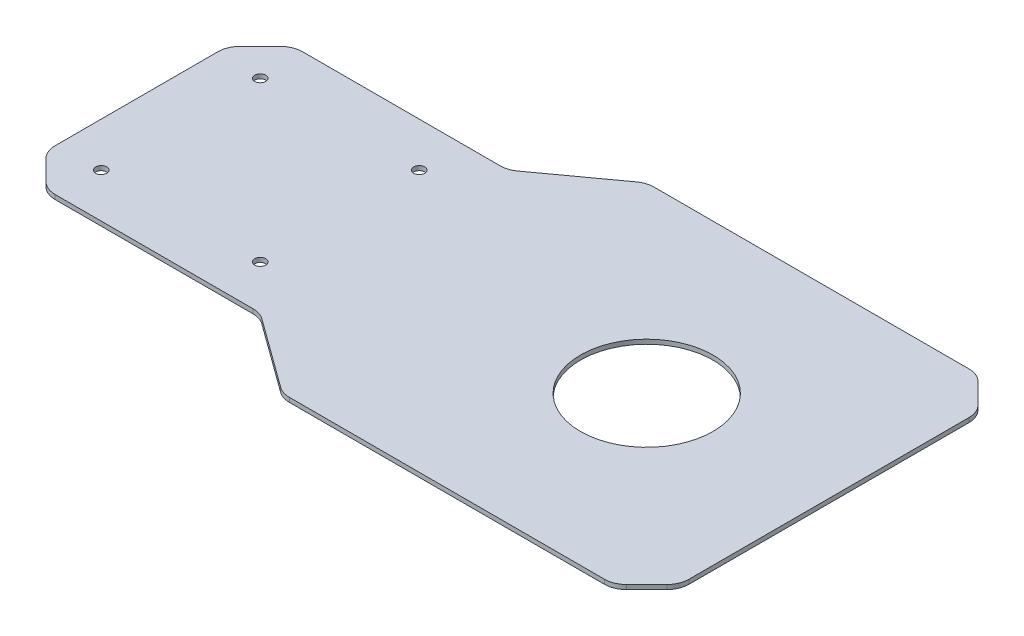
ISO-10303-21;
HEADER;
FILE_DESCRIPTION(('STEP AP214'),'2;1');
FILE_NAME('part.step','',(''),(''),'','','');
FILE_SCHEMA(('AUTOMOTIVE_DESIGN { 1 0 10303 214 1 1 1 1 }'));
ENDSEC;
DATA;
#1=APPLICATION_CONTEXT('core data for automotive mechanical design processes');
#2=APPLICATION_PROTOCOL_DEFINITION('international standard','automotive_design',2000,#1);
#3=PRODUCT_CONTEXT('',#1,'mechanical');
#4=PRODUCT('Part','Part','',(#3));
#5=PRODUCT_RELATED_PRODUCT_CATEGORY('part','',(#4));
#6=PRODUCT_DEFINITION_FORMATION('','',#4);
#7=PRODUCT_DEFINITION_CONTEXT('part definition',#1,'design');
#8=PRODUCT_DEFINITION('design','',#6,#7);
#9=PRODUCT_DEFINITION_SHAPE('','',#8);
#10=(LENGTH_UNIT() NAMED_UNIT(*) SI_UNIT(.MILLI.,.METRE.));
#11=(NAMED_UNIT(*) PLANE_ANGLE_UNIT() SI_UNIT($,.RADIAN.));
#12=(NAMED_UNIT(*) SI_UNIT($,.STERADIAN.) SOLID_ANGLE_UNIT());
#13=UNCERTAINTY_MEASURE_WITH_UNIT(LENGTH_MEASURE(1.E-05),#10,'distance_accuracy_value','');
#14=(GEOMETRIC_REPRESENTATION_CONTEXT(3) GLOBAL_UNCERTAINTY_ASSIGNED_CONTEXT((#13)) GLOBAL_UNIT_ASSIGNED_CONTEXT((#10,
#11,#12)) REPRESENTATION_CONTEXT('',''));
#15=CARTESIAN_POINT('',(0.,0.,0.));
#16=DIRECTION('',(0.,0.,1.));
#17=DIRECTION('',(1.,0.,0.));
#18=AXIS2_PLACEMENT_3D('',#15,#16,#17);
#19=CARTESIAN_POINT('',(257.5,2.,-82.5));
#20=DIRECTION('',(-1.,0.,0.));
#21=DIRECTION('',(0.,0.,1.));
#22=AXIS2_PLACEMENT_3D('',#19,#20,#21);
#23=PLANE('',#22);
#24=DIRECTION('',(0.,0.,-1.));
#25=VECTOR('',#24,1.);
#26=CARTESIAN_POINT('',(257.5,0.,-82.5));
#27=LINE('',#26,#25);
#28=CARTESIAN_POINT('',(257.5,0.,63.357864376269));
#29=VERTEX_POINT('',#28);
#30=CARTESIAN_POINT('',(257.5,0.,-63.357864376269));
#31=VERTEX_POINT('',#30);
#32=EDGE_CURVE('E421',#29,#31,#27,.T.);
#33=ORIENTED_EDGE('',*,*,#32,.T.);
#34=DIRECTION('',(0.,-1.,0.));
#35=VECTOR('',#34,1.);
#36=CARTESIAN_POINT('',(257.5,2.,-63.357864376269));
#37=LINE('',#36,#35);
#38=CARTESIAN_POINT('',(257.5,2.,-63.357864376269));
#39=VERTEX_POINT('',#38);
#40=EDGE_CURVE('E338',#31,#39,#37,.F.);
#41=ORIENTED_EDGE('',*,*,#40,.T.);
#42=DIRECTION('',(0.,0.,-1.));
#43=VECTOR('',#42,1.);
#44=CARTESIAN_POINT('',(257.5,2.,-82.5));
#45=LINE('',#44,#43);
#46=CARTESIAN_POINT('',(257.5,2.,63.357864376269));
#47=VERTEX_POINT('',#46);
#48=EDGE_CURVE('E445',#47,#39,#45,.T.);
#49=ORIENTED_EDGE('',*,*,#48,.F.);
#50=DIRECTION('',(0.,1.,0.));
#51=VECTOR('',#50,1.);
#52=CARTESIAN_POINT('',(257.5,0.,63.357864376269));
#53=LINE('',#52,#51);
#54=EDGE_CURVE('E334',#47,#29,#53,.F.);
#55=ORIENTED_EDGE('',*,*,#54,.T.);
#56=EDGE_LOOP('',(#33,#41,#49,#55));
#57=FACE_BOUND('',#56,.T.);
#58=ADVANCED_FACE('F41',(#57),#23,.F.);
#59=CARTESIAN_POINT('',(92.5,2.,-82.5));
#60=DIRECTION('',(0.,0.,1.));
#61=DIRECTION('',(1.,0.,0.));
#62=AXIS2_PLACEMENT_3D('',#59,#60,#61);
#63=PLANE('',#62);
#64=DIRECTION('',(-1.,0.,0.));
#65=VECTOR('',#64,1.);
#66=CARTESIAN_POINT('',(92.5,2.,-82.5));
#67=LINE('',#66,#65);
#68=CARTESIAN_POINT('',(238.357864376269,2.,-82.5));
#69=VERTEX_POINT('',#68);
#70=CARTESIAN_POINT('',(95.7473328473115,2.,-82.5));
#71=VERTEX_POINT('',#70);
#72=EDGE_CURVE('E405',#69,#71,#67,.T.);
#73=ORIENTED_EDGE('',*,*,#72,.F.);
#74=DIRECTION('',(0.,1.,0.));
#75=VECTOR('',#74,1.);
#76=CARTESIAN_POINT('',(238.357864376269,0.,-82.5));
#77=LINE('',#76,#75);
#78=CARTESIAN_POINT('',(238.357864376269,0.,-82.5));
#79=VERTEX_POINT('',#78);
#80=EDGE_CURVE('E324',#69,#79,#77,.F.);
#81=ORIENTED_EDGE('',*,*,#80,.T.);
#82=DIRECTION('',(-1.,0.,0.));
#83=VECTOR('',#82,1.);
#84=CARTESIAN_POINT('',(92.5,0.,-82.5));
#85=LINE('',#84,#83);
#86=CARTESIAN_POINT('',(95.7473328473115,0.,-82.5));
#87=VERTEX_POINT('',#86);
#88=EDGE_CURVE('E392',#79,#87,#85,.T.);
#89=ORIENTED_EDGE('',*,*,#88,.T.);
#90=DIRECTION('',(0.,-1.,0.));
#91=VECTOR('',#90,1.);
#92=CARTESIAN_POINT('',(95.7473328473115,2.,-82.5));
#93=LINE('',#92,#91);
#94=EDGE_CURVE('E321',#87,#71,#93,.F.);
#95=ORIENTED_EDGE('',*,*,#94,.T.);
#96=EDGE_LOOP('',(#73,#81,#89,#95));
#97=FACE_BOUND('',#96,.T.);
#98=ADVANCED_FACE('F502',(#97),#63,.F.);
#99=CARTESIAN_POINT('',(56.,2.,-56.));
#100=DIRECTION('',(0.587512385943699,0.,0.809215173092264));
#101=DIRECTION('',(0.809215173092264,0.,-0.587512385943699));
#102=AXIS2_PLACEMENT_3D('',#99,#100,#101);
#103=PLANE('',#102);
#104=DIRECTION('',(-0.809215173092264,0.,0.587512385943699));
#105=VECTOR('',#104,1.);
#106=CARTESIAN_POINT('',(56.,0.,-56.));
#107=LINE('',#106,#105);
#108=CARTESIAN_POINT('',(89.8722089878745,0.,-80.5921517309227));
#109=VERTEX_POINT('',#108);
#110=CARTESIAN_POINT('',(58.6277910121254,0.,-57.9078482690774));
#111=VERTEX_POINT('',#110);
#112=EDGE_CURVE('E380',#109,#111,#107,.T.);
#113=ORIENTED_EDGE('',*,*,#112,.T.);
#114=DIRECTION('',(0.,-1.,0.));
#115=VECTOR('',#114,1.);
#116=CARTESIAN_POINT('',(58.6277910121254,2.,-57.9078482690774));
#117=LINE('',#116,#115);
#118=CARTESIAN_POINT('',(58.6277910121254,2.,-57.9078482690774));
#119=VERTEX_POINT('',#118);
#120=EDGE_CURVE('E367',#111,#119,#117,.F.);
#121=ORIENTED_EDGE('',*,*,#120,.T.);
#122=DIRECTION('',(-0.809215173092264,0.,0.587512385943699));
#123=VECTOR('',#122,1.);
#124=CARTESIAN_POINT('',(56.,2.,-56.));
#125=LINE('',#124,#123);
#126=CARTESIAN_POINT('',(89.8722089878745,2.,-80.5921517309227));
#127=VERTEX_POINT('',#126);
#128=EDGE_CURVE('E398',#127,#119,#125,.T.);
#129=ORIENTED_EDGE('',*,*,#128,.F.);
#130=DIRECTION('',(0.,-1.,0.));
#131=VECTOR('',#130,1.);
#132=CARTESIAN_POINT('',(89.8722089878745,2.,-80.5921517309227));
#133=LINE('',#132,#131);
#134=EDGE_CURVE('E363',#127,#109,#133,.T.);
#135=ORIENTED_EDGE('',*,*,#134,.T.);
#136=EDGE_LOOP('',(#113,#121,#129,#135));
#137=FACE_BOUND('',#136,.T.);
#138=ADVANCED_FACE('F387',(#137),#103,.F.);
#139=CARTESIAN_POINT('',(-56.,2.,-56.));
#140=DIRECTION('',(0.,0.,1.));
#141=DIRECTION('',(1.,0.,0.));
#142=AXIS2_PLACEMENT_3D('',#139,#140,#141);
#143=PLANE('',#142);
#144=DIRECTION('',(-1.,0.,0.));
#145=VECTOR('',#144,1.);
#146=CARTESIAN_POINT('',(-56.,0.,-56.));
#147=LINE('',#146,#145);
#148=CARTESIAN_POINT('',(52.7526671526884,0.,-56.));
#149=VERTEX_POINT('',#148);
#150=CARTESIAN_POINT('',(-36.857864376269,0.,-56.));
#151=VERTEX_POINT('',#150);
#152=EDGE_CURVE('E382',#149,#151,#147,.T.);
#153=ORIENTED_EDGE('',*,*,#152,.T.);
#154=DIRECTION('',(0.,-1.,0.));
#155=VECTOR('',#154,1.);
#156=CARTESIAN_POINT('',(-36.857864376269,2.,-56.));
#157=LINE('',#156,#155);
#158=CARTESIAN_POINT('',(-36.857864376269,2.,-56.));
#159=VERTEX_POINT('',#158);
#160=EDGE_CURVE('E317',#151,#159,#157,.F.);
#161=ORIENTED_EDGE('',*,*,#160,.T.);
#162=DIRECTION('',(-1.,0.,0.));
#163=VECTOR('',#162,1.);
#164=CARTESIAN_POINT('',(-56.,2.,-56.));
#165=LINE('',#164,#163);
#166=CARTESIAN_POINT('',(52.7526671526884,2.,-56.));
#167=VERTEX_POINT('',#166);
#168=EDGE_CURVE('E229',#167,#159,#165,.T.);
#169=ORIENTED_EDGE('',*,*,#168,.F.);
#170=DIRECTION('',(0.,-1.,0.));
#171=VECTOR('',#170,1.);
#172=CARTESIAN_POINT('',(52.7526671526884,0.,-56.));
#173=LINE('',#172,#171);
#174=EDGE_CURVE('E313',#167,#149,#173,.T.);
#175=ORIENTED_EDGE('',*,*,#174,.T.);
#176=EDGE_LOOP('',(#153,#161,#169,#175));
#177=FACE_BOUND('',#176,.T.);
#178=ADVANCED_FACE('F400',(#177),#143,.F.);
#179=CARTESIAN_POINT('',(-56.,2.,-56.));
#180=DIRECTION('',(1.,0.,0.));
#181=DIRECTION('',(0.,0.,-1.));
#182=AXIS2_PLACEMENT_3D('',#179,#180,#181);
#183=PLANE('',#182);
#184=DIRECTION('',(0.,0.,1.));
#185=VECTOR('',#184,1.);
#186=CARTESIAN_POINT('',(-56.,0.,-56.));
#187=LINE('',#186,#185);
#188=CARTESIAN_POINT('',(-56.,0.,-36.857864376269));
#189=VERTEX_POINT('',#188);
#190=CARTESIAN_POINT('',(-56.,0.,36.857864376269));
#191=VERTEX_POINT('',#190);
#192=EDGE_CURVE('E431',#189,#191,#187,.T.);
#193=ORIENTED_EDGE('',*,*,#192,.T.);
#194=DIRECTION('',(0.,-1.,0.));
#195=VECTOR('',#194,1.);
#196=CARTESIAN_POINT('',(-56.,2.,36.857864376269));
#197=LINE('',#196,#195);
#198=CARTESIAN_POINT('',(-56.,2.,36.857864376269));
#199=VERTEX_POINT('',#198);
#200=EDGE_CURVE('E226',#191,#199,#197,.F.);
#201=ORIENTED_EDGE('',*,*,#200,.T.);
#202=DIRECTION('',(0.,0.,1.));
#203=VECTOR('',#202,1.);
#204=CARTESIAN_POINT('',(-56.,2.,-56.));
#205=LINE('',#204,#203);
#206=CARTESIAN_POINT('',(-56.,2.,-36.857864376269));
#207=VERTEX_POINT('',#206);
#208=EDGE_CURVE('E208',#207,#199,#205,.T.);
#209=ORIENTED_EDGE('',*,*,#208,.F.);
#210=DIRECTION('',(0.,1.,0.));
#211=VECTOR('',#210,1.);
#212=CARTESIAN_POINT('',(-56.,0.,-36.857864376269));
#213=LINE('',#212,#211);
#214=EDGE_CURVE('E223',#207,#189,#213,.F.);
#215=ORIENTED_EDGE('',*,*,#214,.T.);
#216=EDGE_LOOP('',(#193,#201,#209,#215));
#217=FACE_BOUND('',#216,.T.);
#218=ADVANCED_FACE('F222',(#217),#183,.F.);
#219=CARTESIAN_POINT('',(-56.,2.,56.));
#220=DIRECTION('',(0.,0.,-1.));
#221=DIRECTION('',(-1.,0.,0.));
#222=AXIS2_PLACEMENT_3D('',#219,#220,#221);
#223=PLANE('',#222);
#224=DIRECTION('',(1.,0.,0.));
#225=VECTOR('',#224,1.);
#226=CARTESIAN_POINT('',(-56.,2.,56.));
#227=LINE('',#226,#225);
#228=CARTESIAN_POINT('',(-36.857864376269,2.,56.));
#229=VERTEX_POINT('',#228);
#230=CARTESIAN_POINT('',(52.7526671526884,2.,56.));
#231=VERTEX_POINT('',#230);
#232=EDGE_CURVE('E228',#229,#231,#227,.T.);
#233=ORIENTED_EDGE('',*,*,#232,.F.);
#234=DIRECTION('',(0.,1.,0.));
#235=VECTOR('',#234,1.);
#236=CARTESIAN_POINT('',(-36.857864376269,0.,56.));
#237=LINE('',#236,#235);
#238=CARTESIAN_POINT('',(-36.857864376269,0.,56.));
#239=VERTEX_POINT('',#238);
#240=EDGE_CURVE('E304',#229,#239,#237,.F.);
#241=ORIENTED_EDGE('',*,*,#240,.T.);
#242=DIRECTION('',(1.,0.,0.));
#243=VECTOR('',#242,1.);
#244=CARTESIAN_POINT('',(-56.,0.,56.));
#245=LINE('',#244,#243);
#246=CARTESIAN_POINT('',(52.7526671526884,0.,56.));
#247=VERTEX_POINT('',#246);
#248=EDGE_CURVE('E434',#239,#247,#245,.T.);
#249=ORIENTED_EDGE('',*,*,#248,.T.);
#250=DIRECTION('',(0.,-1.,0.));
#251=VECTOR('',#250,1.);
#252=CARTESIAN_POINT('',(52.7526671526884,2.,56.));
#253=LINE('',#252,#251);
#254=EDGE_CURVE('E301',#247,#231,#253,.F.);
#255=ORIENTED_EDGE('',*,*,#254,.T.);
#256=EDGE_LOOP('',(#233,#241,#249,#255));
#257=FACE_BOUND('',#256,.T.);
#258=ADVANCED_FACE('F476',(#257),#223,.F.);
#259=CARTESIAN_POINT('',(56.,2.,56.));
#260=DIRECTION('',(0.587512385943699,0.,-0.809215173092264));
#261=DIRECTION('',(-0.809215173092264,0.,-0.587512385943699));
#262=AXIS2_PLACEMENT_3D('',#259,#260,#261);
#263=PLANE('',#262);
#264=DIRECTION('',(0.809215173092264,0.,0.587512385943698));
#265=VECTOR('',#264,1.);
#266=CARTESIAN_POINT('',(56.,2.,56.));
#267=LINE('',#266,#265);
#268=CARTESIAN_POINT('',(58.6277910121254,2.,57.9078482690774));
#269=VERTEX_POINT('',#268);
#270=CARTESIAN_POINT('',(89.8722089878746,2.,80.5921517309226));
#271=VERTEX_POINT('',#270);
#272=EDGE_CURVE('E412',#269,#271,#267,.T.);
#273=ORIENTED_EDGE('',*,*,#272,.F.);
#274=DIRECTION('',(0.,-1.,0.));
#275=VECTOR('',#274,1.);
#276=CARTESIAN_POINT('',(58.6277910121254,0.,57.9078482690774));
#277=LINE('',#276,#275);
#278=CARTESIAN_POINT('',(58.6277910121254,0.,57.9078482690774));
#279=VERTEX_POINT('',#278);
#280=EDGE_CURVE('E359',#269,#279,#277,.T.);
#281=ORIENTED_EDGE('',*,*,#280,.T.);
#282=DIRECTION('',(0.809215173092264,0.,0.587512385943698));
#283=VECTOR('',#282,1.);
#284=CARTESIAN_POINT('',(56.,0.,56.));
#285=LINE('',#284,#283);
#286=CARTESIAN_POINT('',(89.8722089878746,0.,80.5921517309226));
#287=VERTEX_POINT('',#286);
#288=EDGE_CURVE('E437',#279,#287,#285,.T.);
#289=ORIENTED_EDGE('',*,*,#288,.T.);
#290=DIRECTION('',(0.,-1.,0.));
#291=VECTOR('',#290,1.);
#292=CARTESIAN_POINT('',(89.8722089878746,2.,80.5921517309226));
#293=LINE('',#292,#291);
#294=EDGE_CURVE('E356',#287,#271,#293,.F.);
#295=ORIENTED_EDGE('',*,*,#294,.T.);
#296=EDGE_LOOP('',(#273,#281,#289,#295));
#297=FACE_BOUND('',#296,.T.);
#298=ADVANCED_FACE('F701',(#297),#263,.F.);
#299=CARTESIAN_POINT('',(92.5,2.,82.5));
#300=DIRECTION('',(0.,0.,-1.));
#301=DIRECTION('',(-1.,0.,0.));
#302=AXIS2_PLACEMENT_3D('',#299,#300,#301);
#303=PLANE('',#302);
#304=DIRECTION('',(1.,0.,0.));
#305=VECTOR('',#304,1.);
#306=CARTESIAN_POINT('',(92.5,0.,82.5));
#307=LINE('',#306,#305);
#308=CARTESIAN_POINT('',(95.7473328473116,0.,82.5));
#309=VERTEX_POINT('',#308);
#310=CARTESIAN_POINT('',(238.357864376269,0.,82.5));
#311=VERTEX_POINT('',#310);
#312=EDGE_CURVE('E441',#309,#311,#307,.T.);
#313=ORIENTED_EDGE('',*,*,#312,.T.);
#314=DIRECTION('',(0.,-1.,0.));
#315=VECTOR('',#314,1.);
#316=CARTESIAN_POINT('',(238.357864376269,2.,82.5));
#317=LINE('',#316,#315);
#318=CARTESIAN_POINT('',(238.357864376269,2.,82.5));
#319=VERTEX_POINT('',#318);
#320=EDGE_CURVE('E352',#311,#319,#317,.F.);
#321=ORIENTED_EDGE('',*,*,#320,.T.);
#322=DIRECTION('',(1.,0.,0.));
#323=VECTOR('',#322,1.);
#324=CARTESIAN_POINT('',(92.5,2.,82.5));
#325=LINE('',#324,#323);
#326=CARTESIAN_POINT('',(95.7473328473116,2.,82.5));
#327=VERTEX_POINT('',#326);
#328=EDGE_CURVE('E416',#327,#319,#325,.T.);
#329=ORIENTED_EDGE('',*,*,#328,.F.);
#330=DIRECTION('',(0.,-1.,0.));
#331=VECTOR('',#330,1.);
#332=CARTESIAN_POINT('',(95.7473328473116,2.,82.5));
#333=LINE('',#332,#331);
#334=EDGE_CURVE('E348',#327,#309,#333,.T.);
#335=ORIENTED_EDGE('',*,*,#334,.T.);
#336=EDGE_LOOP('',(#313,#321,#329,#335));
#337=FACE_BOUND('',#336,.T.);
#338=ADVANCED_FACE('F633',(#337),#303,.F.);
#339=CARTESIAN_POINT('',(0.,2.,0.));
#340=DIRECTION('',(0.,1.,0.));
#341=DIRECTION('',(0.,0.,1.));
#342=AXIS2_PLACEMENT_3D('',#339,#340,#341);
#343=PLANE('',#342);
#344=CARTESIAN_POINT('',(175.,2.,0.));
#345=DIRECTION('',(0.,1.,0.));
#346=DIRECTION('',(0.,0.,1.));
#347=AXIS2_PLACEMENT_3D('',#344,#345,#346);
#348=CIRCLE('',#347,30.);
#349=CARTESIAN_POINT('',(175.,2.,30.));
#350=VERTEX_POINT('',#349);
#351=EDGE_CURVE('E819',#350,#350,#348,.T.);
#352=ORIENTED_EDGE('',*,*,#351,.F.);
#353=EDGE_LOOP('',(#352));
#354=FACE_BOUND('',#353,.T.);
#355=CARTESIAN_POINT('',(36.0000000000007,2.,36.));
#356=DIRECTION('',(0.,1.,0.));
#357=DIRECTION('',(0.,0.,1.));
#358=AXIS2_PLACEMENT_3D('',#355,#356,#357);
#359=CIRCLE('',#358,2.5);
#360=CARTESIAN_POINT('',(36.0000000000007,2.,38.5));
#361=VERTEX_POINT('',#360);
#362=EDGE_CURVE('E827',#361,#361,#359,.T.);
#363=ORIENTED_EDGE('',*,*,#362,.F.);
#364=EDGE_LOOP('',(#363));
#365=FACE_BOUND('',#364,.T.);
#366=CARTESIAN_POINT('',(-35.9999999999992,2.,36.0000000000005));
#367=DIRECTION('',(0.,1.,0.));
#368=DIRECTION('',(0.,0.,1.));
#369=AXIS2_PLACEMENT_3D('',#366,#367,#368);
#370=CIRCLE('',#369,2.5);
#371=CARTESIAN_POINT('',(-35.9999999999992,2.,38.5000000000005));
#372=VERTEX_POINT('',#371);
#373=EDGE_CURVE('E835',#372,#372,#370,.T.);
#374=ORIENTED_EDGE('',*,*,#373,.F.);
#375=EDGE_LOOP('',(#374));
#376=FACE_BOUND('',#375,.T.);
#377=CARTESIAN_POINT('',(-36.,2.,-35.9999999999995));
#378=DIRECTION('',(0.,1.,0.));
#379=DIRECTION('',(0.,0.,1.));
#380=AXIS2_PLACEMENT_3D('',#377,#378,#379);
#381=CIRCLE('',#380,2.5);
#382=CARTESIAN_POINT('',(-36.,2.,-33.4999999999995));
#383=VERTEX_POINT('',#382);
#384=EDGE_CURVE('E843',#383,#383,#381,.T.);
#385=ORIENTED_EDGE('',*,*,#384,.F.);
#386=EDGE_LOOP('',(#385));
#387=FACE_BOUND('',#386,.T.);
#388=CARTESIAN_POINT('',(36.,2.,-36.0000000000003));
#389=DIRECTION('',(0.,1.,0.));
#390=DIRECTION('',(0.,0.,1.));
#391=AXIS2_PLACEMENT_3D('',#388,#389,#390);
#392=CIRCLE('',#391,2.49999999999993);
#393=CARTESIAN_POINT('',(36.,2.,-33.5000000000003));
#394=VERTEX_POINT('',#393);
#395=EDGE_CURVE('E811',#394,#394,#392,.T.);
#396=ORIENTED_EDGE('',*,*,#395,.F.);
#397=EDGE_LOOP('',(#396));
#398=FACE_BOUND('',#397,.T.);
#399=ORIENTED_EDGE('',*,*,#208,.T.);
#400=CARTESIAN_POINT('',(-46.,2.,36.857864376269));
#401=DIRECTION('',(0.,1.,0.));
#402=DIRECTION('',(0.,0.,1.));
#403=AXIS2_PLACEMENT_3D('',#400,#401,#402);
#404=CIRCLE('',#403,10.);
#405=CARTESIAN_POINT('',(-53.0710678118655,2.,43.9289321881344));
#406=VERTEX_POINT('',#405);
#407=EDGE_CURVE('E264',#199,#406,#404,.T.);
#408=ORIENTED_EDGE('',*,*,#407,.T.);
#409=DIRECTION('',(-0.707106781186546,0.,-0.707106781186549));
#410=VECTOR('',#409,1.);
#411=CARTESIAN_POINT('',(-48.5000000000001,2.,48.4999999999999));
#412=LINE('',#411,#410);
#413=CARTESIAN_POINT('',(-43.9289321881345,2.,53.0710678118654));
#414=VERTEX_POINT('',#413);
#415=EDGE_CURVE('E239',#406,#414,#412,.F.);
#416=ORIENTED_EDGE('',*,*,#415,.T.);
#417=CARTESIAN_POINT('',(-36.857864376269,2.,46.));
#418=DIRECTION('',(0.,1.,0.));
#419=DIRECTION('',(0.,0.,1.));
#420=AXIS2_PLACEMENT_3D('',#417,#418,#419);
#421=CIRCLE('',#420,10.);
#422=EDGE_CURVE('E215',#414,#229,#421,.T.);
#423=ORIENTED_EDGE('',*,*,#422,.T.);
#424=ORIENTED_EDGE('',*,*,#232,.T.);
#425=CARTESIAN_POINT('',(52.7526671526884,2.,66.));
#426=DIRECTION('',(0.,1.,0.));
#427=DIRECTION('',(0.,0.,1.));
#428=AXIS2_PLACEMENT_3D('',#425,#426,#427);
#429=CIRCLE('',#428,10.);
#430=EDGE_CURVE('E372',#231,#269,#429,.F.);
#431=ORIENTED_EDGE('',*,*,#430,.T.);
#432=ORIENTED_EDGE('',*,*,#272,.T.);
#433=CARTESIAN_POINT('',(95.7473328473116,2.,72.5));
#434=DIRECTION('',(0.,1.,0.));
#435=DIRECTION('',(0.,0.,1.));
#436=AXIS2_PLACEMENT_3D('',#433,#434,#435);
#437=CIRCLE('',#436,10.);
#438=EDGE_CURVE('E237',#271,#327,#437,.T.);
#439=ORIENTED_EDGE('',*,*,#438,.T.);
#440=ORIENTED_EDGE('',*,*,#328,.T.);
#441=CARTESIAN_POINT('',(238.357864376269,2.,72.5));
#442=DIRECTION('',(0.,1.,0.));
#443=DIRECTION('',(0.,0.,1.));
#444=AXIS2_PLACEMENT_3D('',#441,#442,#443);
#445=CIRCLE('',#444,10.);
#446=CARTESIAN_POINT('',(245.428932188134,2.,79.5710678118655));
#447=VERTEX_POINT('',#446);
#448=EDGE_CURVE('E248',#319,#447,#445,.T.);
#449=ORIENTED_EDGE('',*,*,#448,.T.);
#450=DIRECTION('',(-0.70710678118655,0.,0.707106781186545));
#451=VECTOR('',#450,1.);
#452=CARTESIAN_POINT('',(162.499999999999,2.,162.5));
#453=LINE('',#452,#451);
#454=CARTESIAN_POINT('',(254.571067811865,2.,70.4289321881345));
#455=VERTEX_POINT('',#454);
#456=EDGE_CURVE('E460',#447,#455,#453,.F.);
#457=ORIENTED_EDGE('',*,*,#456,.T.);
#458=CARTESIAN_POINT('',(247.5,2.,63.357864376269));
#459=DIRECTION('',(0.,1.,0.));
#460=DIRECTION('',(0.,0.,1.));
#461=AXIS2_PLACEMENT_3D('',#458,#459,#460);
#462=CIRCLE('',#461,10.);
#463=EDGE_CURVE('E251',#455,#47,#462,.T.);
#464=ORIENTED_EDGE('',*,*,#463,.T.);
#465=ORIENTED_EDGE('',*,*,#48,.T.);
#466=CARTESIAN_POINT('',(247.5,2.,-63.357864376269));
#467=DIRECTION('',(0.,1.,0.));
#468=DIRECTION('',(0.,0.,1.));
#469=AXIS2_PLACEMENT_3D('',#466,#467,#468);
#470=CIRCLE('',#469,10.);
#471=CARTESIAN_POINT('',(254.571067811866,2.,-70.4289321881344));
#472=VERTEX_POINT('',#471);
#473=EDGE_CURVE('E254',#39,#472,#470,.T.);
#474=ORIENTED_EDGE('',*,*,#473,.T.);
#475=DIRECTION('',(0.707106781186546,0.,0.707106781186549));
#476=VECTOR('',#475,1.);
#477=CARTESIAN_POINT('',(162.5,2.,-162.5));
#478=LINE('',#477,#476);
#479=CARTESIAN_POINT('',(245.428932188134,2.,-79.5710678118655));
#480=VERTEX_POINT('',#479);
#481=EDGE_CURVE('E464',#472,#480,#478,.F.);
#482=ORIENTED_EDGE('',*,*,#481,.T.);
#483=CARTESIAN_POINT('',(238.357864376269,2.,-72.5));
#484=DIRECTION('',(0.,1.,0.));
#485=DIRECTION('',(0.,0.,1.));
#486=AXIS2_PLACEMENT_3D('',#483,#484,#485);
#487=CIRCLE('',#486,10.);
#488=EDGE_CURVE('E257',#480,#69,#487,.T.);
#489=ORIENTED_EDGE('',*,*,#488,.T.);
#490=ORIENTED_EDGE('',*,*,#72,.T.);
#491=CARTESIAN_POINT('',(95.7473328473115,2.,-72.5));
#492=DIRECTION('',(0.,1.,0.));
#493=DIRECTION('',(0.,0.,1.));
#494=AXIS2_PLACEMENT_3D('',#491,#492,#493);
#495=CIRCLE('',#494,10.);
#496=EDGE_CURVE('E245',#71,#127,#495,.T.);
#497=ORIENTED_EDGE('',*,*,#496,.T.);
#498=ORIENTED_EDGE('',*,*,#128,.T.);
#499=CARTESIAN_POINT('',(52.7526671526884,2.,-66.));
#500=DIRECTION('',(0.,1.,0.));
#501=DIRECTION('',(0.,0.,1.));
#502=AXIS2_PLACEMENT_3D('',#499,#500,#501);
#503=CIRCLE('',#502,10.);
#504=EDGE_CURVE('E11',#119,#167,#503,.F.);
#505=ORIENTED_EDGE('',*,*,#504,.T.);
#506=ORIENTED_EDGE('',*,*,#168,.T.);
#507=CARTESIAN_POINT('',(-36.857864376269,2.,-46.));
#508=DIRECTION('',(0.,1.,0.));
#509=DIRECTION('',(0.,0.,1.));
#510=AXIS2_PLACEMENT_3D('',#507,#508,#509);
#511=CIRCLE('',#510,10.);
#512=CARTESIAN_POINT('',(-43.9289321881344,2.,-53.0710678118655));
#513=VERTEX_POINT('',#512);
#514=EDGE_CURVE('E216',#159,#513,#511,.T.);
#515=ORIENTED_EDGE('',*,*,#514,.T.);
#516=DIRECTION('',(0.70710678118655,0.,-0.707106781186545));
#517=VECTOR('',#516,1.);
#518=CARTESIAN_POINT('',(-48.4999999999998,2.,-48.5000000000002));
#519=LINE('',#518,#517);
#520=CARTESIAN_POINT('',(-53.0710678118654,2.,-43.9289321881345));
#521=VERTEX_POINT('',#520);
#522=EDGE_CURVE('E210',#513,#521,#519,.F.);
#523=ORIENTED_EDGE('',*,*,#522,.T.);
#524=CARTESIAN_POINT('',(-46.,2.,-36.857864376269));
#525=DIRECTION('',(0.,1.,0.));
#526=DIRECTION('',(0.,0.,1.));
#527=AXIS2_PLACEMENT_3D('',#524,#525,#526);
#528=CIRCLE('',#527,10.);
#529=EDGE_CURVE('E205',#521,#207,#528,.T.);
#530=ORIENTED_EDGE('',*,*,#529,.T.);
#531=EDGE_LOOP('',(#399,#408,#416,#423,#424,#431,#432,#439,#440,#449,#457,#464,#465,#474,#482,
#489,#490,#497,#498,#505,#506,#515,#523,#530));
#532=FACE_BOUND('',#531,.T.);
#533=ADVANCED_FACE('F207',(#354,#365,#376,#387,#398,#532),#343,.T.);
#534=CARTESIAN_POINT('',(0.,0.,0.));
#535=DIRECTION('',(0.,1.,0.));
#536=DIRECTION('',(0.,0.,1.));
#537=AXIS2_PLACEMENT_3D('',#534,#535,#536);
#538=PLANE('',#537);
#539=CARTESIAN_POINT('',(175.,0.,0.));
#540=DIRECTION('',(0.,1.,0.));
#541=DIRECTION('',(0.,0.,1.));
#542=AXIS2_PLACEMENT_3D('',#539,#540,#541);
#543=CIRCLE('',#542,30.);
#544=CARTESIAN_POINT('',(175.,0.,30.));
#545=VERTEX_POINT('',#544);
#546=EDGE_CURVE('E823',#545,#545,#543,.T.);
#547=ORIENTED_EDGE('',*,*,#546,.T.);
#548=EDGE_LOOP('',(#547));
#549=FACE_BOUND('',#548,.T.);
#550=CARTESIAN_POINT('',(36.0000000000007,0.,36.));
#551=DIRECTION('',(0.,1.,0.));
#552=DIRECTION('',(0.,0.,1.));
#553=AXIS2_PLACEMENT_3D('',#550,#551,#552);
#554=CIRCLE('',#553,2.5);
#555=CARTESIAN_POINT('',(36.0000000000007,0.,38.5));
#556=VERTEX_POINT('',#555);
#557=EDGE_CURVE('E831',#556,#556,#554,.T.);
#558=ORIENTED_EDGE('',*,*,#557,.T.);
#559=EDGE_LOOP('',(#558));
#560=FACE_BOUND('',#559,.T.);
#561=CARTESIAN_POINT('',(-35.9999999999992,0.,36.0000000000005));
#562=DIRECTION('',(0.,1.,0.));
#563=DIRECTION('',(0.,0.,1.));
#564=AXIS2_PLACEMENT_3D('',#561,#562,#563);
#565=CIRCLE('',#564,2.5);
#566=CARTESIAN_POINT('',(-35.9999999999992,0.,38.5000000000005));
#567=VERTEX_POINT('',#566);
#568=EDGE_CURVE('E839',#567,#567,#565,.T.);
#569=ORIENTED_EDGE('',*,*,#568,.T.);
#570=EDGE_LOOP('',(#569));
#571=FACE_BOUND('',#570,.T.);
#572=CARTESIAN_POINT('',(-36.,0.,-35.9999999999995));
#573=DIRECTION('',(0.,1.,0.));
#574=DIRECTION('',(0.,0.,1.));
#575=AXIS2_PLACEMENT_3D('',#572,#573,#574);
#576=CIRCLE('',#575,2.5);
#577=CARTESIAN_POINT('',(-36.,0.,-33.4999999999995));
#578=VERTEX_POINT('',#577);
#579=EDGE_CURVE('E815',#578,#578,#576,.T.);
#580=ORIENTED_EDGE('',*,*,#579,.T.);
#581=EDGE_LOOP('',(#580));
#582=FACE_BOUND('',#581,.T.);
#583=CARTESIAN_POINT('',(36.,0.,-36.0000000000003));
#584=DIRECTION('',(0.,1.,0.));
#585=DIRECTION('',(0.,0.,1.));
#586=AXIS2_PLACEMENT_3D('',#583,#584,#585);
#587=CIRCLE('',#586,2.49999999999993);
#588=CARTESIAN_POINT('',(36.,0.,-33.5000000000003));
#589=VERTEX_POINT('',#588);
#590=EDGE_CURVE('E425',#589,#589,#587,.T.);
#591=ORIENTED_EDGE('',*,*,#590,.T.);
#592=EDGE_LOOP('',(#591));
#593=FACE_BOUND('',#592,.T.);
#594=DIRECTION('',(0.707106781186546,0.,0.707106781186549));
#595=VECTOR('',#594,1.);
#596=CARTESIAN_POINT('',(-41.,0.,56.));
#597=LINE('',#596,#595);
#598=CARTESIAN_POINT('',(-43.9289321881345,0.,53.0710678118655));
#599=VERTEX_POINT('',#598);
#600=CARTESIAN_POINT('',(-53.0710678118655,0.,43.9289321881344));
#601=VERTEX_POINT('',#600);
#602=EDGE_CURVE('E453',#599,#601,#597,.F.);
#603=ORIENTED_EDGE('',*,*,#602,.T.);
#604=CARTESIAN_POINT('',(-46.,0.,36.857864376269));
#605=DIRECTION('',(0.,1.,0.));
#606=DIRECTION('',(0.,0.,1.));
#607=AXIS2_PLACEMENT_3D('',#604,#605,#606);
#608=CIRCLE('',#607,10.);
#609=EDGE_CURVE('E298',#601,#191,#608,.F.);
#610=ORIENTED_EDGE('',*,*,#609,.T.);
#611=ORIENTED_EDGE('',*,*,#192,.F.);
#612=CARTESIAN_POINT('',(-46.,0.,-36.857864376269));
#613=DIRECTION('',(0.,1.,0.));
#614=DIRECTION('',(0.,0.,1.));
#615=AXIS2_PLACEMENT_3D('',#612,#613,#614);
#616=CIRCLE('',#615,10.);
#617=CARTESIAN_POINT('',(-53.0710678118655,0.,-43.9289321881345));
#618=VERTEX_POINT('',#617);
#619=EDGE_CURVE('E232',#189,#618,#616,.F.);
#620=ORIENTED_EDGE('',*,*,#619,.T.);
#621=DIRECTION('',(-0.70710678118655,0.,0.707106781186545));
#622=VECTOR('',#621,1.);
#623=CARTESIAN_POINT('',(-56.,0.,-41.));
#624=LINE('',#623,#622);
#625=CARTESIAN_POINT('',(-43.9289321881344,0.,-53.0710678118655));
#626=VERTEX_POINT('',#625);
#627=EDGE_CURVE('E456',#618,#626,#624,.F.);
#628=ORIENTED_EDGE('',*,*,#627,.T.);
#629=CARTESIAN_POINT('',(-36.857864376269,0.,-46.));
#630=DIRECTION('',(0.,1.,0.));
#631=DIRECTION('',(0.,0.,1.));
#632=AXIS2_PLACEMENT_3D('',#629,#630,#631);
#633=CIRCLE('',#632,10.);
#634=EDGE_CURVE('E291',#626,#151,#633,.F.);
#635=ORIENTED_EDGE('',*,*,#634,.T.);
#636=ORIENTED_EDGE('',*,*,#152,.F.);
#637=CARTESIAN_POINT('',(52.7526671526884,0.,-66.));
#638=DIRECTION('',(0.,1.,0.));
#639=DIRECTION('',(0.,0.,1.));
#640=AXIS2_PLACEMENT_3D('',#637,#638,#639);
#641=CIRCLE('',#640,10.);
#642=EDGE_CURVE('E50',#149,#111,#641,.T.);
#643=ORIENTED_EDGE('',*,*,#642,.T.);
#644=ORIENTED_EDGE('',*,*,#112,.F.);
#645=CARTESIAN_POINT('',(95.7473328473115,0.,-72.5));
#646=DIRECTION('',(0.,1.,0.));
#647=DIRECTION('',(0.,0.,1.));
#648=AXIS2_PLACEMENT_3D('',#645,#646,#647);
#649=CIRCLE('',#648,10.);
#650=EDGE_CURVE('E276',#109,#87,#649,.F.);
#651=ORIENTED_EDGE('',*,*,#650,.T.);
#652=ORIENTED_EDGE('',*,*,#88,.F.);
#653=CARTESIAN_POINT('',(238.357864376269,0.,-72.5));
#654=DIRECTION('',(0.,1.,0.));
#655=DIRECTION('',(0.,0.,1.));
#656=AXIS2_PLACEMENT_3D('',#653,#654,#655);
#657=CIRCLE('',#656,10.);
#658=CARTESIAN_POINT('',(245.428932188134,0.,-79.5710678118655));
#659=VERTEX_POINT('',#658);
#660=EDGE_CURVE('E288',#79,#659,#657,.F.);
#661=ORIENTED_EDGE('',*,*,#660,.T.);
#662=DIRECTION('',(-0.707106781186546,0.,-0.707106781186549));
#663=VECTOR('',#662,1.);
#664=CARTESIAN_POINT('',(242.5,0.,-82.5));
#665=LINE('',#664,#663);
#666=CARTESIAN_POINT('',(254.571067811866,0.,-70.4289321881344));
#667=VERTEX_POINT('',#666);
#668=EDGE_CURVE('E449',#659,#667,#665,.F.);
#669=ORIENTED_EDGE('',*,*,#668,.T.);
#670=CARTESIAN_POINT('',(247.5,0.,-63.357864376269));
#671=DIRECTION('',(0.,1.,0.));
#672=DIRECTION('',(0.,0.,1.));
#673=AXIS2_PLACEMENT_3D('',#670,#671,#672);
#674=CIRCLE('',#673,10.);
#675=EDGE_CURVE('E285',#667,#31,#674,.F.);
#676=ORIENTED_EDGE('',*,*,#675,.T.);
#677=ORIENTED_EDGE('',*,*,#32,.F.);
#678=CARTESIAN_POINT('',(247.5,0.,63.357864376269));
#679=DIRECTION('',(0.,1.,0.));
#680=DIRECTION('',(0.,0.,1.));
#681=AXIS2_PLACEMENT_3D('',#678,#679,#680);
#682=CIRCLE('',#681,10.);
#683=CARTESIAN_POINT('',(254.571067811865,0.,70.4289321881345));
#684=VERTEX_POINT('',#683);
#685=EDGE_CURVE('E282',#29,#684,#682,.F.);
#686=ORIENTED_EDGE('',*,*,#685,.T.);
#687=DIRECTION('',(0.70710678118655,0.,-0.707106781186545));
#688=VECTOR('',#687,1.);
#689=CARTESIAN_POINT('',(257.5,0.,67.5));
#690=LINE('',#689,#688);
#691=CARTESIAN_POINT('',(245.428932188134,0.,79.5710678118655));
#692=VERTEX_POINT('',#691);
#693=EDGE_CURVE('E420',#684,#692,#690,.F.);
#694=ORIENTED_EDGE('',*,*,#693,.T.);
#695=CARTESIAN_POINT('',(238.357864376269,0.,72.5));
#696=DIRECTION('',(0.,1.,0.));
#697=DIRECTION('',(0.,0.,1.));
#698=AXIS2_PLACEMENT_3D('',#695,#696,#697);
#699=CIRCLE('',#698,10.);
#700=EDGE_CURVE('E279',#692,#311,#699,.F.);
#701=ORIENTED_EDGE('',*,*,#700,.T.);
#702=ORIENTED_EDGE('',*,*,#312,.F.);
#703=CARTESIAN_POINT('',(95.7473328473116,0.,72.5));
#704=DIRECTION('',(0.,1.,0.));
#705=DIRECTION('',(0.,0.,1.));
#706=AXIS2_PLACEMENT_3D('',#703,#704,#705);
#707=CIRCLE('',#706,10.);
#708=EDGE_CURVE('E273',#309,#287,#707,.F.);
#709=ORIENTED_EDGE('',*,*,#708,.T.);
#710=ORIENTED_EDGE('',*,*,#288,.F.);
#711=CARTESIAN_POINT('',(52.7526671526884,0.,66.));
#712=DIRECTION('',(0.,1.,0.));
#713=DIRECTION('',(0.,0.,1.));
#714=AXIS2_PLACEMENT_3D('',#711,#712,#713);
#715=CIRCLE('',#714,10.);
#716=EDGE_CURVE('E57',#279,#247,#715,.T.);
#717=ORIENTED_EDGE('',*,*,#716,.T.);
#718=ORIENTED_EDGE('',*,*,#248,.F.);
#719=CARTESIAN_POINT('',(-36.857864376269,0.,46.));
#720=DIRECTION('',(0.,1.,0.));
#721=DIRECTION('',(0.,0.,1.));
#722=AXIS2_PLACEMENT_3D('',#719,#720,#721);
#723=CIRCLE('',#722,10.);
#724=EDGE_CURVE('E65',#239,#599,#723,.F.);
#725=ORIENTED_EDGE('',*,*,#724,.T.);
#726=EDGE_LOOP('',(#603,#610,#611,#620,#628,#635,#636,#643,#644,#651,#652,#661,#669,#676,#677,
#686,#694,#701,#702,#709,#710,#717,#718,#725));
#727=FACE_BOUND('',#726,.T.);
#728=ADVANCED_FACE('F379',(#549,#560,#571,#582,#593,#727),#538,.F.);
#729=CARTESIAN_POINT('',(-56.,2.,-41.));
#730=DIRECTION('',(0.707106781186545,0.,0.70710678118655));
#731=DIRECTION('',(0.,-1.,0.));
#732=AXIS2_PLACEMENT_3D('',#729,#730,#731);
#733=PLANE('',#732);
#734=ORIENTED_EDGE('',*,*,#627,.F.);
#735=DIRECTION('',(0.,-1.,0.));
#736=VECTOR('',#735,1.);
#737=CARTESIAN_POINT('',(-53.0710678118655,2.,-43.9289321881345));
#738=LINE('',#737,#736);
#739=EDGE_CURVE('E310',#618,#521,#738,.F.);
#740=ORIENTED_EDGE('',*,*,#739,.T.);
#741=ORIENTED_EDGE('',*,*,#522,.F.);
#742=DIRECTION('',(0.,1.,0.));
#743=VECTOR('',#742,1.);
#744=CARTESIAN_POINT('',(-43.9289321881344,0.,-53.0710678118655));
#745=LINE('',#744,#743);
#746=EDGE_CURVE('E307',#513,#626,#745,.F.);
#747=ORIENTED_EDGE('',*,*,#746,.T.);
#748=EDGE_LOOP('',(#734,#740,#741,#747));
#749=FACE_BOUND('',#748,.T.);
#750=ADVANCED_FACE('F486',(#749),#733,.F.);
#751=CARTESIAN_POINT('',(-41.,2.,56.));
#752=DIRECTION('',(0.707106781186549,0.,-0.707106781186546));
#753=DIRECTION('',(0.,-1.,0.));
#754=AXIS2_PLACEMENT_3D('',#751,#752,#753);
#755=PLANE('',#754);
#756=ORIENTED_EDGE('',*,*,#415,.F.);
#757=DIRECTION('',(0.,1.,0.));
#758=VECTOR('',#757,1.);
#759=CARTESIAN_POINT('',(-53.0710678118655,0.,43.9289321881344));
#760=LINE('',#759,#758);
#761=EDGE_CURVE('E270',#406,#601,#760,.F.);
#762=ORIENTED_EDGE('',*,*,#761,.T.);
#763=ORIENTED_EDGE('',*,*,#602,.F.);
#764=DIRECTION('',(0.,-1.,0.));
#765=VECTOR('',#764,1.);
#766=CARTESIAN_POINT('',(-43.9289321881345,2.,53.0710678118655));
#767=LINE('',#766,#765);
#768=EDGE_CURVE('E267',#599,#414,#767,.F.);
#769=ORIENTED_EDGE('',*,*,#768,.T.);
#770=EDGE_LOOP('',(#756,#762,#763,#769));
#771=FACE_BOUND('',#770,.T.);
#772=ADVANCED_FACE('F480',(#771),#755,.F.);
#773=CARTESIAN_POINT('',(242.5,2.,-82.5));
#774=DIRECTION('',(-0.707106781186549,0.,0.707106781186546));
#775=DIRECTION('',(0.,-1.,0.));
#776=AXIS2_PLACEMENT_3D('',#773,#774,#775);
#777=PLANE('',#776);
#778=ORIENTED_EDGE('',*,*,#668,.F.);
#779=DIRECTION('',(0.,-1.,0.));
#780=VECTOR('',#779,1.);
#781=CARTESIAN_POINT('',(245.428932188134,2.,-79.5710678118655));
#782=LINE('',#781,#780);
#783=EDGE_CURVE('E331',#659,#480,#782,.F.);
#784=ORIENTED_EDGE('',*,*,#783,.T.);
#785=ORIENTED_EDGE('',*,*,#481,.F.);
#786=DIRECTION('',(0.,1.,0.));
#787=VECTOR('',#786,1.);
#788=CARTESIAN_POINT('',(254.571067811866,0.,-70.4289321881344));
#789=LINE('',#788,#787);
#790=EDGE_CURVE('E328',#472,#667,#789,.F.);
#791=ORIENTED_EDGE('',*,*,#790,.T.);
#792=EDGE_LOOP('',(#778,#784,#785,#791));
#793=FACE_BOUND('',#792,.T.);
#794=ADVANCED_FACE('F523',(#793),#777,.F.);
#795=CARTESIAN_POINT('',(257.5,2.,67.5));
#796=DIRECTION('',(-0.707106781186545,0.,-0.70710678118655));
#797=DIRECTION('',(0.,-1.,0.));
#798=AXIS2_PLACEMENT_3D('',#795,#796,#797);
#799=PLANE('',#798);
#800=ORIENTED_EDGE('',*,*,#693,.F.);
#801=DIRECTION('',(0.,-1.,0.));
#802=VECTOR('',#801,1.);
#803=CARTESIAN_POINT('',(254.571067811865,2.,70.4289321881345));
#804=LINE('',#803,#802);
#805=EDGE_CURVE('E345',#684,#455,#804,.F.);
#806=ORIENTED_EDGE('',*,*,#805,.T.);
#807=ORIENTED_EDGE('',*,*,#456,.F.);
#808=DIRECTION('',(0.,1.,0.));
#809=VECTOR('',#808,1.);
#810=CARTESIAN_POINT('',(245.428932188134,0.,79.5710678118655));
#811=LINE('',#810,#809);
#812=EDGE_CURVE('E342',#447,#692,#811,.F.);
#813=ORIENTED_EDGE('',*,*,#812,.T.);
#814=EDGE_LOOP('',(#800,#806,#807,#813));
#815=FACE_BOUND('',#814,.T.);
#816=ADVANCED_FACE('F529',(#815),#799,.F.);
#817=CARTESIAN_POINT('',(-46.,2.,36.857864376269));
#818=DIRECTION('',(0.,1.,0.));
#819=DIRECTION('',(0.,0.,1.));
#820=AXIS2_PLACEMENT_3D('',#817,#818,#819);
#821=CYLINDRICAL_SURFACE('',#820,10.);
#822=ORIENTED_EDGE('',*,*,#609,.F.);
#823=ORIENTED_EDGE('',*,*,#761,.F.);
#824=ORIENTED_EDGE('',*,*,#407,.F.);
#825=ORIENTED_EDGE('',*,*,#200,.F.);
#826=EDGE_LOOP('',(#822,#823,#824,#825));
#827=FACE_BOUND('',#826,.T.);
#828=ADVANCED_FACE('F482',(#827),#821,.T.);
#829=CARTESIAN_POINT('',(-36.857864376269,2.,46.));
#830=DIRECTION('',(0.,-1.,0.));
#831=DIRECTION('',(0.,0.,-1.));
#832=AXIS2_PLACEMENT_3D('',#829,#830,#831);
#833=CYLINDRICAL_SURFACE('',#832,10.);
#834=ORIENTED_EDGE('',*,*,#422,.F.);
#835=ORIENTED_EDGE('',*,*,#768,.F.);
#836=ORIENTED_EDGE('',*,*,#724,.F.);
#837=ORIENTED_EDGE('',*,*,#240,.F.);
#838=EDGE_LOOP('',(#834,#835,#836,#837));
#839=FACE_BOUND('',#838,.T.);
#840=ADVANCED_FACE('F474',(#839),#833,.T.);
#841=CARTESIAN_POINT('',(-46.,2.,-36.857864376269));
#842=DIRECTION('',(0.,-1.,0.));
#843=DIRECTION('',(0.,0.,-1.));
#844=AXIS2_PLACEMENT_3D('',#841,#842,#843);
#845=CYLINDRICAL_SURFACE('',#844,10.);
#846=ORIENTED_EDGE('',*,*,#529,.F.);
#847=ORIENTED_EDGE('',*,*,#739,.F.);
#848=ORIENTED_EDGE('',*,*,#619,.F.);
#849=ORIENTED_EDGE('',*,*,#214,.F.);
#850=EDGE_LOOP('',(#846,#847,#848,#849));
#851=FACE_BOUND('',#850,.T.);
#852=ADVANCED_FACE('F231',(#851),#845,.T.);
#853=CARTESIAN_POINT('',(-36.857864376269,2.,-46.));
#854=DIRECTION('',(0.,1.,0.));
#855=DIRECTION('',(0.,0.,1.));
#856=AXIS2_PLACEMENT_3D('',#853,#854,#855);
#857=CYLINDRICAL_SURFACE('',#856,10.);
#858=ORIENTED_EDGE('',*,*,#634,.F.);
#859=ORIENTED_EDGE('',*,*,#746,.F.);
#860=ORIENTED_EDGE('',*,*,#514,.F.);
#861=ORIENTED_EDGE('',*,*,#160,.F.);
#862=EDGE_LOOP('',(#858,#859,#860,#861));
#863=FACE_BOUND('',#862,.T.);
#864=ADVANCED_FACE('F489',(#863),#857,.T.);
#865=CARTESIAN_POINT('',(238.357864376269,2.,-72.5));
#866=DIRECTION('',(0.,-1.,0.));
#867=DIRECTION('',(0.,0.,-1.));
#868=AXIS2_PLACEMENT_3D('',#865,#866,#867);
#869=CYLINDRICAL_SURFACE('',#868,10.);
#870=ORIENTED_EDGE('',*,*,#488,.F.);
#871=ORIENTED_EDGE('',*,*,#783,.F.);
#872=ORIENTED_EDGE('',*,*,#660,.F.);
#873=ORIENTED_EDGE('',*,*,#80,.F.);
#874=EDGE_LOOP('',(#870,#871,#872,#873));
#875=FACE_BOUND('',#874,.T.);
#876=ADVANCED_FACE('F491',(#875),#869,.T.);
#877=CARTESIAN_POINT('',(247.5,2.,-63.357864376269));
#878=DIRECTION('',(0.,1.,0.));
#879=DIRECTION('',(0.,0.,1.));
#880=AXIS2_PLACEMENT_3D('',#877,#878,#879);
#881=CYLINDRICAL_SURFACE('',#880,10.);
#882=ORIENTED_EDGE('',*,*,#675,.F.);
#883=ORIENTED_EDGE('',*,*,#790,.F.);
#884=ORIENTED_EDGE('',*,*,#473,.F.);
#885=ORIENTED_EDGE('',*,*,#40,.F.);
#886=EDGE_LOOP('',(#882,#883,#884,#885));
#887=FACE_BOUND('',#886,.T.);
#888=ADVANCED_FACE('F497',(#887),#881,.T.);
#889=CARTESIAN_POINT('',(247.5,2.,63.357864376269));
#890=DIRECTION('',(0.,-1.,0.));
#891=DIRECTION('',(0.,0.,-1.));
#892=AXIS2_PLACEMENT_3D('',#889,#890,#891);
#893=CYLINDRICAL_SURFACE('',#892,10.);
#894=ORIENTED_EDGE('',*,*,#463,.F.);
#895=ORIENTED_EDGE('',*,*,#805,.F.);
#896=ORIENTED_EDGE('',*,*,#685,.F.);
#897=ORIENTED_EDGE('',*,*,#54,.F.);
#898=EDGE_LOOP('',(#894,#895,#896,#897));
#899=FACE_BOUND('',#898,.T.);
#900=ADVANCED_FACE('F566',(#899),#893,.T.);
#901=CARTESIAN_POINT('',(238.357864376269,2.,72.5));
#902=DIRECTION('',(0.,1.,0.));
#903=DIRECTION('',(0.,0.,1.));
#904=AXIS2_PLACEMENT_3D('',#901,#902,#903);
#905=CYLINDRICAL_SURFACE('',#904,10.);
#906=ORIENTED_EDGE('',*,*,#700,.F.);
#907=ORIENTED_EDGE('',*,*,#812,.F.);
#908=ORIENTED_EDGE('',*,*,#448,.F.);
#909=ORIENTED_EDGE('',*,*,#320,.F.);
#910=EDGE_LOOP('',(#906,#907,#908,#909));
#911=FACE_BOUND('',#910,.T.);
#912=ADVANCED_FACE('F576',(#911),#905,.T.);
#913=CARTESIAN_POINT('',(52.7526671526884,2.,66.));
#914=DIRECTION('',(0.,1.,0.));
#915=DIRECTION('',(0.,0.,1.));
#916=AXIS2_PLACEMENT_3D('',#913,#914,#915);
#917=CYLINDRICAL_SURFACE('',#916,10.);
#918=ORIENTED_EDGE('',*,*,#430,.F.);
#919=ORIENTED_EDGE('',*,*,#254,.F.);
#920=ORIENTED_EDGE('',*,*,#716,.F.);
#921=ORIENTED_EDGE('',*,*,#280,.F.);
#922=EDGE_LOOP('',(#918,#919,#920,#921));
#923=FACE_BOUND('',#922,.T.);
#924=ADVANCED_FACE('F586',(#923),#917,.F.);
#925=CARTESIAN_POINT('',(52.7526671526884,2.,-66.));
#926=DIRECTION('',(0.,1.,0.));
#927=DIRECTION('',(0.,0.,1.));
#928=AXIS2_PLACEMENT_3D('',#925,#926,#927);
#929=CYLINDRICAL_SURFACE('',#928,10.);
#930=ORIENTED_EDGE('',*,*,#504,.F.);
#931=ORIENTED_EDGE('',*,*,#120,.F.);
#932=ORIENTED_EDGE('',*,*,#642,.F.);
#933=ORIENTED_EDGE('',*,*,#174,.F.);
#934=EDGE_LOOP('',(#930,#931,#932,#933));
#935=FACE_BOUND('',#934,.T.);
#936=ADVANCED_FACE('F395',(#935),#929,.F.);
#937=CARTESIAN_POINT('',(95.7473328473115,2.,-72.5));
#938=DIRECTION('',(0.,-1.,0.));
#939=DIRECTION('',(0.,0.,-1.));
#940=AXIS2_PLACEMENT_3D('',#937,#938,#939);
#941=CYLINDRICAL_SURFACE('',#940,10.);
#942=ORIENTED_EDGE('',*,*,#496,.F.);
#943=ORIENTED_EDGE('',*,*,#94,.F.);
#944=ORIENTED_EDGE('',*,*,#650,.F.);
#945=ORIENTED_EDGE('',*,*,#134,.F.);
#946=EDGE_LOOP('',(#942,#943,#944,#945));
#947=FACE_BOUND('',#946,.T.);
#948=ADVANCED_FACE('F605',(#947),#941,.T.);
#949=CARTESIAN_POINT('',(95.7473328473116,2.,72.5));
#950=DIRECTION('',(0.,-1.,0.));
#951=DIRECTION('',(0.,0.,-1.));
#952=AXIS2_PLACEMENT_3D('',#949,#950,#951);
#953=CYLINDRICAL_SURFACE('',#952,10.);
#954=ORIENTED_EDGE('',*,*,#438,.F.);
#955=ORIENTED_EDGE('',*,*,#294,.F.);
#956=ORIENTED_EDGE('',*,*,#708,.F.);
#957=ORIENTED_EDGE('',*,*,#334,.F.);
#958=EDGE_LOOP('',(#954,#955,#956,#957));
#959=FACE_BOUND('',#958,.T.);
#960=ADVANCED_FACE('F43',(#959),#953,.T.);
#961=CARTESIAN_POINT('',(36.,0.,-36.0000000000003));
#962=DIRECTION('',(0.,1.,0.));
#963=DIRECTION('',(0.,0.,1.));
#964=AXIS2_PLACEMENT_3D('',#961,#962,#963);
#965=CYLINDRICAL_SURFACE('',#964,2.49999999999993);
#966=ORIENTED_EDGE('',*,*,#590,.F.);
#967=EDGE_LOOP('',(#966));
#968=FACE_BOUND('',#967,.T.);
#969=ORIENTED_EDGE('',*,*,#395,.T.);
#970=EDGE_LOOP('',(#969));
#971=FACE_BOUND('',#970,.T.);
#972=ADVANCED_FACE('F622',(#968,#971),#965,.F.);
#973=CARTESIAN_POINT('',(-36.,0.,-35.9999999999995));
#974=DIRECTION('',(0.,1.,0.));
#975=DIRECTION('',(0.,0.,1.));
#976=AXIS2_PLACEMENT_3D('',#973,#974,#975);
#977=CYLINDRICAL_SURFACE('',#976,2.5);
#978=ORIENTED_EDGE('',*,*,#579,.F.);
#979=EDGE_LOOP('',(#978));
#980=FACE_BOUND('',#979,.T.);
#981=ORIENTED_EDGE('',*,*,#384,.T.);
#982=EDGE_LOOP('',(#981));
#983=FACE_BOUND('',#982,.T.);
#984=ADVANCED_FACE('F653',(#980,#983),#977,.F.);
#985=CARTESIAN_POINT('',(-35.9999999999992,0.,36.0000000000005));
#986=DIRECTION('',(0.,1.,0.));
#987=DIRECTION('',(0.,0.,1.));
#988=AXIS2_PLACEMENT_3D('',#985,#986,#987);
#989=CYLINDRICAL_SURFACE('',#988,2.5);
#990=ORIENTED_EDGE('',*,*,#568,.F.);
#991=EDGE_LOOP('',(#990));
#992=FACE_BOUND('',#991,.T.);
#993=ORIENTED_EDGE('',*,*,#373,.T.);
#994=EDGE_LOOP('',(#993));
#995=FACE_BOUND('',#994,.T.);
#996=ADVANCED_FACE('F663',(#992,#995),#989,.F.);
#997=CARTESIAN_POINT('',(36.0000000000007,0.,36.));
#998=DIRECTION('',(0.,1.,0.));
#999=DIRECTION('',(0.,0.,1.));
#1000=AXIS2_PLACEMENT_3D('',#997,#998,#999);
#1001=CYLINDRICAL_SURFACE('',#1000,2.5);
#1002=ORIENTED_EDGE('',*,*,#557,.F.);
#1003=EDGE_LOOP('',(#1002));
#1004=FACE_BOUND('',#1003,.T.);
#1005=ORIENTED_EDGE('',*,*,#362,.T.);
#1006=EDGE_LOOP('',(#1005));
#1007=FACE_BOUND('',#1006,.T.);
#1008=ADVANCED_FACE('F673',(#1004,#1007),#1001,.F.);
#1009=CARTESIAN_POINT('',(175.,0.,0.));
#1010=DIRECTION('',(0.,1.,0.));
#1011=DIRECTION('',(0.,0.,1.));
#1012=AXIS2_PLACEMENT_3D('',#1009,#1010,#1011);
#1013=CYLINDRICAL_SURFACE('',#1012,30.);
#1014=ORIENTED_EDGE('',*,*,#546,.F.);
#1015=EDGE_LOOP('',(#1014));
#1016=FACE_BOUND('',#1015,.T.);
#1017=ORIENTED_EDGE('',*,*,#351,.T.);
#1018=EDGE_LOOP('',(#1017));
#1019=FACE_BOUND('',#1018,.T.);
#1020=ADVANCED_FACE('F683',(#1016,#1019),#1013,.F.);
#1021=CLOSED_SHELL('',(#58,#98,#138,#178,#218,#258,#298,#338,#533,#728,#750,#772,#794,#816,#828,
#840,#852,#864,#876,#888,#900,#912,#924,#936,#948,#960,#972,#984,#996,#1008,#1020));
#1022=MANIFOLD_SOLID_BREP('B2',#1021);
#1023=ADVANCED_BREP_SHAPE_REPRESENTATION('',(#18,#1022),#14);
#1024=SHAPE_DEFINITION_REPRESENTATION(#9,#1023);
ENDSEC;
END-ISO-10303-21;
